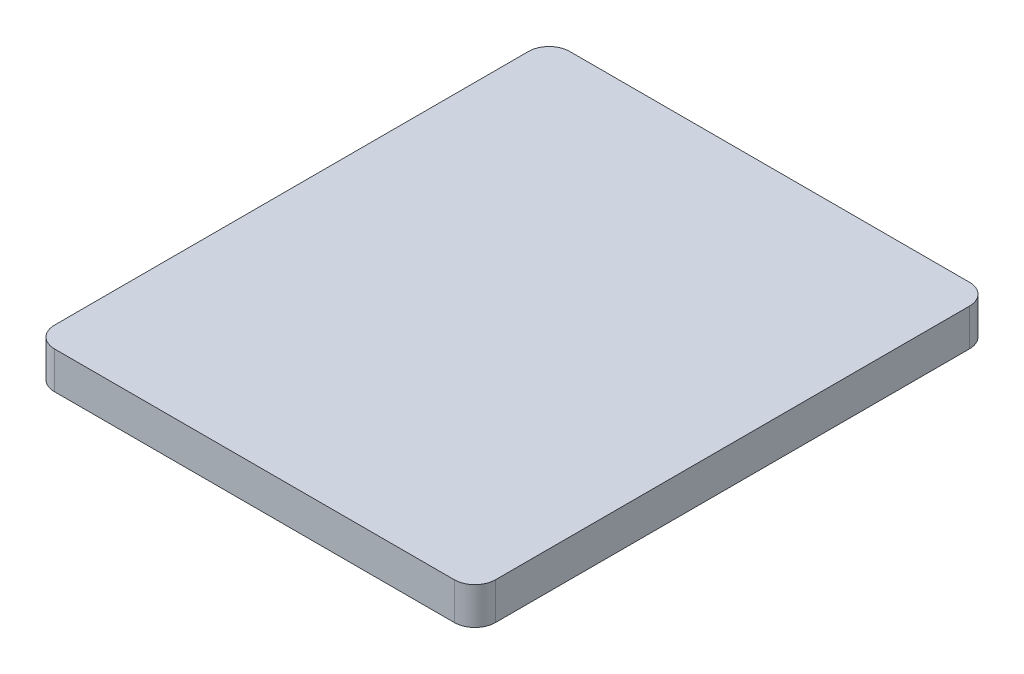
ISO-10303-21;
HEADER;
FILE_DESCRIPTION(('STEP AP214'),'2;1');
FILE_NAME('part.step','',(''),(''),'','','');
FILE_SCHEMA(('AUTOMOTIVE_DESIGN { 1 0 10303 214 1 1 1 1 }'));
ENDSEC;
DATA;
#1=APPLICATION_CONTEXT('core data for automotive mechanical design processes');
#2=APPLICATION_PROTOCOL_DEFINITION('international standard','automotive_design',2000,#1);
#3=PRODUCT_CONTEXT('',#1,'mechanical');
#4=PRODUCT('Part','Part','',(#3));
#5=PRODUCT_RELATED_PRODUCT_CATEGORY('part','',(#4));
#6=PRODUCT_DEFINITION_FORMATION('','',#4);
#7=PRODUCT_DEFINITION_CONTEXT('part definition',#1,'design');
#8=PRODUCT_DEFINITION('design','',#6,#7);
#9=PRODUCT_DEFINITION_SHAPE('','',#8);
#10=(LENGTH_UNIT() NAMED_UNIT(*) SI_UNIT(.MILLI.,.METRE.));
#11=(NAMED_UNIT(*) PLANE_ANGLE_UNIT() SI_UNIT($,.RADIAN.));
#12=(NAMED_UNIT(*) SI_UNIT($,.STERADIAN.) SOLID_ANGLE_UNIT());
#13=UNCERTAINTY_MEASURE_WITH_UNIT(LENGTH_MEASURE(1.E-05),#10,'distance_accuracy_value','');
#14=(GEOMETRIC_REPRESENTATION_CONTEXT(3) GLOBAL_UNCERTAINTY_ASSIGNED_CONTEXT((#13)) GLOBAL_UNIT_ASSIGNED_CONTEXT((#10,
#11,#12)) REPRESENTATION_CONTEXT('',''));
#15=CARTESIAN_POINT('',(0.,0.,0.));
#16=DIRECTION('',(0.,0.,1.));
#17=DIRECTION('',(1.,0.,0.));
#18=AXIS2_PLACEMENT_3D('',#15,#16,#17);
#19=CARTESIAN_POINT('',(-107.,18.,125.));
#20=DIRECTION('',(1.,0.,0.));
#21=DIRECTION('',(0.,0.,-1.));
#22=AXIS2_PLACEMENT_3D('',#19,#20,#21);
#23=PLANE('',#22);
#24=DIRECTION('',(0.,0.,1.));
#25=VECTOR('',#24,1.);
#26=CARTESIAN_POINT('',(-107.,18.,125.));
#27=LINE('',#26,#25);
#28=CARTESIAN_POINT('',(-107.,18.,-115.));
#29=VERTEX_POINT('',#28);
#30=CARTESIAN_POINT('',(-107.,18.,115.));
#31=VERTEX_POINT('',#30);
#32=EDGE_CURVE('E124',#29,#31,#27,.T.);
#33=ORIENTED_EDGE('',*,*,#32,.F.);
#34=DIRECTION('',(0.,-1.,0.));
#35=VECTOR('',#34,1.);
#36=CARTESIAN_POINT('',(-107.,18.,-115.));
#37=LINE('',#36,#35);
#38=CARTESIAN_POINT('',(-107.,0.,-115.));
#39=VERTEX_POINT('',#38);
#40=EDGE_CURVE('E109',#29,#39,#37,.T.);
#41=ORIENTED_EDGE('',*,*,#40,.T.);
#42=DIRECTION('',(0.,0.,1.));
#43=VECTOR('',#42,1.);
#44=CARTESIAN_POINT('',(-107.,0.,125.));
#45=LINE('',#44,#43);
#46=CARTESIAN_POINT('',(-107.,0.,115.));
#47=VERTEX_POINT('',#46);
#48=EDGE_CURVE('E121',#39,#47,#45,.T.);
#49=ORIENTED_EDGE('',*,*,#48,.T.);
#50=DIRECTION('',(0.,-1.,0.));
#51=VECTOR('',#50,1.);
#52=CARTESIAN_POINT('',(-107.,18.,115.));
#53=LINE('',#52,#51);
#54=EDGE_CURVE('E126',#47,#31,#53,.F.);
#55=ORIENTED_EDGE('',*,*,#54,.T.);
#56=EDGE_LOOP('',(#33,#41,#49,#55));
#57=FACE_BOUND('',#56,.T.);
#58=ADVANCED_FACE('F39',(#57),#23,.F.);
#59=CARTESIAN_POINT('',(-107.,18.,125.));
#60=DIRECTION('',(0.,0.,-1.));
#61=DIRECTION('',(-1.,0.,0.));
#62=AXIS2_PLACEMENT_3D('',#59,#60,#61);
#63=PLANE('',#62);
#64=DIRECTION('',(1.,0.,0.));
#65=VECTOR('',#64,1.);
#66=CARTESIAN_POINT('',(-107.,0.,125.));
#67=LINE('',#66,#65);
#68=CARTESIAN_POINT('',(-97.,0.,125.));
#69=VERTEX_POINT('',#68);
#70=CARTESIAN_POINT('',(97.,0.,125.));
#71=VERTEX_POINT('',#70);
#72=EDGE_CURVE('E130',#69,#71,#67,.T.);
#73=ORIENTED_EDGE('',*,*,#72,.T.);
#74=DIRECTION('',(0.,-1.,0.));
#75=VECTOR('',#74,1.);
#76=CARTESIAN_POINT('',(97.,18.,125.));
#77=LINE('',#76,#75);
#78=CARTESIAN_POINT('',(97.,18.,125.));
#79=VERTEX_POINT('',#78);
#80=EDGE_CURVE('E11',#71,#79,#77,.F.);
#81=ORIENTED_EDGE('',*,*,#80,.T.);
#82=DIRECTION('',(1.,0.,0.));
#83=VECTOR('',#82,1.);
#84=CARTESIAN_POINT('',(-107.,18.,125.));
#85=LINE('',#84,#83);
#86=CARTESIAN_POINT('',(-97.,18.,125.));
#87=VERTEX_POINT('',#86);
#88=EDGE_CURVE('E166',#87,#79,#85,.T.);
#89=ORIENTED_EDGE('',*,*,#88,.F.);
#90=DIRECTION('',(0.,-1.,0.));
#91=VECTOR('',#90,1.);
#92=CARTESIAN_POINT('',(-97.,18.,125.));
#93=LINE('',#92,#91);
#94=EDGE_CURVE('E47',#87,#69,#93,.T.);
#95=ORIENTED_EDGE('',*,*,#94,.T.);
#96=EDGE_LOOP('',(#73,#81,#89,#95));
#97=FACE_BOUND('',#96,.T.);
#98=ADVANCED_FACE('F164',(#97),#63,.F.);
#99=CARTESIAN_POINT('',(107.,18.,125.));
#100=DIRECTION('',(-1.,0.,0.));
#101=DIRECTION('',(0.,0.,1.));
#102=AXIS2_PLACEMENT_3D('',#99,#100,#101);
#103=PLANE('',#102);
#104=DIRECTION('',(0.,0.,-1.));
#105=VECTOR('',#104,1.);
#106=CARTESIAN_POINT('',(107.,0.,125.));
#107=LINE('',#106,#105);
#108=CARTESIAN_POINT('',(107.,0.,115.));
#109=VERTEX_POINT('',#108);
#110=CARTESIAN_POINT('',(107.,0.,-115.));
#111=VERTEX_POINT('',#110);
#112=EDGE_CURVE('E133',#109,#111,#107,.T.);
#113=ORIENTED_EDGE('',*,*,#112,.T.);
#114=DIRECTION('',(0.,-1.,0.));
#115=VECTOR('',#114,1.);
#116=CARTESIAN_POINT('',(107.,18.,-115.));
#117=LINE('',#116,#115);
#118=CARTESIAN_POINT('',(107.,18.,-115.));
#119=VERTEX_POINT('',#118);
#120=EDGE_CURVE('E54',#111,#119,#117,.F.);
#121=ORIENTED_EDGE('',*,*,#120,.T.);
#122=DIRECTION('',(0.,0.,-1.));
#123=VECTOR('',#122,1.);
#124=CARTESIAN_POINT('',(107.,18.,125.));
#125=LINE('',#124,#123);
#126=CARTESIAN_POINT('',(107.,18.,115.));
#127=VERTEX_POINT('',#126);
#128=EDGE_CURVE('E174',#127,#119,#125,.T.);
#129=ORIENTED_EDGE('',*,*,#128,.F.);
#130=DIRECTION('',(0.,-1.,0.));
#131=VECTOR('',#130,1.);
#132=CARTESIAN_POINT('',(107.,18.,115.));
#133=LINE('',#132,#131);
#134=EDGE_CURVE('E157',#127,#109,#133,.T.);
#135=ORIENTED_EDGE('',*,*,#134,.T.);
#136=EDGE_LOOP('',(#113,#121,#129,#135));
#137=FACE_BOUND('',#136,.T.);
#138=ADVANCED_FACE('F173',(#137),#103,.F.);
#139=CARTESIAN_POINT('',(-107.,18.,-125.));
#140=DIRECTION('',(0.,0.,1.));
#141=DIRECTION('',(1.,0.,0.));
#142=AXIS2_PLACEMENT_3D('',#139,#140,#141);
#143=PLANE('',#142);
#144=DIRECTION('',(-1.,0.,0.));
#145=VECTOR('',#144,1.);
#146=CARTESIAN_POINT('',(-107.,0.,-125.));
#147=LINE('',#146,#145);
#148=CARTESIAN_POINT('',(97.,0.,-125.));
#149=VERTEX_POINT('',#148);
#150=CARTESIAN_POINT('',(-97.,0.,-125.));
#151=VERTEX_POINT('',#150);
#152=EDGE_CURVE('E140',#149,#151,#147,.T.);
#153=ORIENTED_EDGE('',*,*,#152,.T.);
#154=DIRECTION('',(0.,-1.,0.));
#155=VECTOR('',#154,1.);
#156=CARTESIAN_POINT('',(-97.,18.,-125.));
#157=LINE('',#156,#155);
#158=CARTESIAN_POINT('',(-97.,18.,-125.));
#159=VERTEX_POINT('',#158);
#160=EDGE_CURVE('E110',#151,#159,#157,.F.);
#161=ORIENTED_EDGE('',*,*,#160,.T.);
#162=DIRECTION('',(-1.,0.,0.));
#163=VECTOR('',#162,1.);
#164=CARTESIAN_POINT('',(-107.,18.,-125.));
#165=LINE('',#164,#163);
#166=CARTESIAN_POINT('',(97.,18.,-125.));
#167=VERTEX_POINT('',#166);
#168=EDGE_CURVE('E136',#167,#159,#165,.T.);
#169=ORIENTED_EDGE('',*,*,#168,.F.);
#170=DIRECTION('',(0.,-1.,0.));
#171=VECTOR('',#170,1.);
#172=CARTESIAN_POINT('',(97.,18.,-125.));
#173=LINE('',#172,#171);
#174=EDGE_CURVE('E115',#167,#149,#173,.T.);
#175=ORIENTED_EDGE('',*,*,#174,.T.);
#176=EDGE_LOOP('',(#153,#161,#169,#175));
#177=FACE_BOUND('',#176,.T.);
#178=ADVANCED_FACE('F202',(#177),#143,.F.);
#179=CARTESIAN_POINT('',(0.,18.,0.));
#180=DIRECTION('',(0.,-1.,0.));
#181=DIRECTION('',(0.,0.,-1.));
#182=AXIS2_PLACEMENT_3D('',#179,#180,#181);
#183=PLANE('',#182);
#184=ORIENTED_EDGE('',*,*,#168,.T.);
#185=CARTESIAN_POINT('',(-97.,18.,-115.));
#186=DIRECTION('',(0.,-1.,0.));
#187=DIRECTION('',(0.,0.,-1.));
#188=AXIS2_PLACEMENT_3D('',#185,#186,#187);
#189=CIRCLE('',#188,10.);
#190=EDGE_CURVE('E155',#159,#29,#189,.F.);
#191=ORIENTED_EDGE('',*,*,#190,.T.);
#192=ORIENTED_EDGE('',*,*,#32,.T.);
#193=CARTESIAN_POINT('',(-97.,18.,115.));
#194=DIRECTION('',(0.,-1.,0.));
#195=DIRECTION('',(0.,0.,-1.));
#196=AXIS2_PLACEMENT_3D('',#193,#194,#195);
#197=CIRCLE('',#196,10.);
#198=EDGE_CURVE('E150',#31,#87,#197,.F.);
#199=ORIENTED_EDGE('',*,*,#198,.T.);
#200=ORIENTED_EDGE('',*,*,#88,.T.);
#201=CARTESIAN_POINT('',(97.,18.,115.));
#202=DIRECTION('',(0.,-1.,0.));
#203=DIRECTION('',(0.,0.,-1.));
#204=AXIS2_PLACEMENT_3D('',#201,#202,#203);
#205=CIRCLE('',#204,10.);
#206=EDGE_CURVE('E61',#79,#127,#205,.F.);
#207=ORIENTED_EDGE('',*,*,#206,.T.);
#208=ORIENTED_EDGE('',*,*,#128,.T.);
#209=CARTESIAN_POINT('',(97.,18.,-115.));
#210=DIRECTION('',(0.,-1.,0.));
#211=DIRECTION('',(0.,0.,-1.));
#212=AXIS2_PLACEMENT_3D('',#209,#210,#211);
#213=CIRCLE('',#212,10.);
#214=EDGE_CURVE('E153',#119,#167,#213,.F.);
#215=ORIENTED_EDGE('',*,*,#214,.T.);
#216=EDGE_LOOP('',(#184,#191,#192,#199,#200,#207,#208,#215));
#217=FACE_BOUND('',#216,.T.);
#218=ADVANCED_FACE('F179',(#217),#183,.F.);
#219=CARTESIAN_POINT('',(0.,0.,0.));
#220=DIRECTION('',(0.,-1.,0.));
#221=DIRECTION('',(0.,0.,-1.));
#222=AXIS2_PLACEMENT_3D('',#219,#220,#221);
#223=PLANE('',#222);
#224=ORIENTED_EDGE('',*,*,#48,.F.);
#225=CARTESIAN_POINT('',(-97.,0.,-115.));
#226=DIRECTION('',(0.,-1.,0.));
#227=DIRECTION('',(0.,0.,-1.));
#228=AXIS2_PLACEMENT_3D('',#225,#226,#227);
#229=CIRCLE('',#228,10.);
#230=EDGE_CURVE('E105',#39,#151,#229,.T.);
#231=ORIENTED_EDGE('',*,*,#230,.T.);
#232=ORIENTED_EDGE('',*,*,#152,.F.);
#233=CARTESIAN_POINT('',(97.,0.,-115.));
#234=DIRECTION('',(0.,-1.,0.));
#235=DIRECTION('',(0.,0.,-1.));
#236=AXIS2_PLACEMENT_3D('',#233,#234,#235);
#237=CIRCLE('',#236,10.);
#238=EDGE_CURVE('E116',#149,#111,#237,.T.);
#239=ORIENTED_EDGE('',*,*,#238,.T.);
#240=ORIENTED_EDGE('',*,*,#112,.F.);
#241=CARTESIAN_POINT('',(97.,0.,115.));
#242=DIRECTION('',(0.,-1.,0.));
#243=DIRECTION('',(0.,0.,-1.));
#244=AXIS2_PLACEMENT_3D('',#241,#242,#243);
#245=CIRCLE('',#244,10.);
#246=EDGE_CURVE('E144',#109,#71,#245,.T.);
#247=ORIENTED_EDGE('',*,*,#246,.T.);
#248=ORIENTED_EDGE('',*,*,#72,.F.);
#249=CARTESIAN_POINT('',(-97.,0.,115.));
#250=DIRECTION('',(0.,-1.,0.));
#251=DIRECTION('',(0.,0.,-1.));
#252=AXIS2_PLACEMENT_3D('',#249,#250,#251);
#253=CIRCLE('',#252,10.);
#254=EDGE_CURVE('E125',#69,#47,#253,.T.);
#255=ORIENTED_EDGE('',*,*,#254,.T.);
#256=EDGE_LOOP('',(#224,#231,#232,#239,#240,#247,#248,#255));
#257=FACE_BOUND('',#256,.T.);
#258=ADVANCED_FACE('F128',(#257),#223,.T.);
#259=CARTESIAN_POINT('',(-97.,18.,-115.));
#260=DIRECTION('',(0.,-1.,0.));
#261=DIRECTION('',(0.,0.,-1.));
#262=AXIS2_PLACEMENT_3D('',#259,#260,#261);
#263=CYLINDRICAL_SURFACE('',#262,10.);
#264=ORIENTED_EDGE('',*,*,#190,.F.);
#265=ORIENTED_EDGE('',*,*,#160,.F.);
#266=ORIENTED_EDGE('',*,*,#230,.F.);
#267=ORIENTED_EDGE('',*,*,#40,.F.);
#268=EDGE_LOOP('',(#264,#265,#266,#267));
#269=FACE_BOUND('',#268,.T.);
#270=ADVANCED_FACE('F108',(#269),#263,.T.);
#271=CARTESIAN_POINT('',(97.,18.,-115.));
#272=DIRECTION('',(0.,-1.,0.));
#273=DIRECTION('',(0.,0.,-1.));
#274=AXIS2_PLACEMENT_3D('',#271,#272,#273);
#275=CYLINDRICAL_SURFACE('',#274,10.);
#276=ORIENTED_EDGE('',*,*,#214,.F.);
#277=ORIENTED_EDGE('',*,*,#120,.F.);
#278=ORIENTED_EDGE('',*,*,#238,.F.);
#279=ORIENTED_EDGE('',*,*,#174,.F.);
#280=EDGE_LOOP('',(#276,#277,#278,#279));
#281=FACE_BOUND('',#280,.T.);
#282=ADVANCED_FACE('F184',(#281),#275,.T.);
#283=CARTESIAN_POINT('',(97.,18.,115.));
#284=DIRECTION('',(0.,-1.,0.));
#285=DIRECTION('',(0.,0.,-1.));
#286=AXIS2_PLACEMENT_3D('',#283,#284,#285);
#287=CYLINDRICAL_SURFACE('',#286,10.);
#288=ORIENTED_EDGE('',*,*,#206,.F.);
#289=ORIENTED_EDGE('',*,*,#80,.F.);
#290=ORIENTED_EDGE('',*,*,#246,.F.);
#291=ORIENTED_EDGE('',*,*,#134,.F.);
#292=EDGE_LOOP('',(#288,#289,#290,#291));
#293=FACE_BOUND('',#292,.T.);
#294=ADVANCED_FACE('F172',(#293),#287,.T.);
#295=CARTESIAN_POINT('',(-97.,18.,115.));
#296=DIRECTION('',(0.,-1.,0.));
#297=DIRECTION('',(0.,0.,-1.));
#298=AXIS2_PLACEMENT_3D('',#295,#296,#297);
#299=CYLINDRICAL_SURFACE('',#298,10.);
#300=ORIENTED_EDGE('',*,*,#198,.F.);
#301=ORIENTED_EDGE('',*,*,#54,.F.);
#302=ORIENTED_EDGE('',*,*,#254,.F.);
#303=ORIENTED_EDGE('',*,*,#94,.F.);
#304=EDGE_LOOP('',(#300,#301,#302,#303));
#305=FACE_BOUND('',#304,.T.);
#306=ADVANCED_FACE('F41',(#305),#299,.T.);
#307=CLOSED_SHELL('',(#58,#98,#138,#178,#218,#258,#270,#282,#294,#306));
#308=MANIFOLD_SOLID_BREP('B2',#307);
#309=ADVANCED_BREP_SHAPE_REPRESENTATION('',(#18,#308),#14);
#310=SHAPE_DEFINITION_REPRESENTATION(#9,#309);
ENDSEC;
END-ISO-10303-21;
